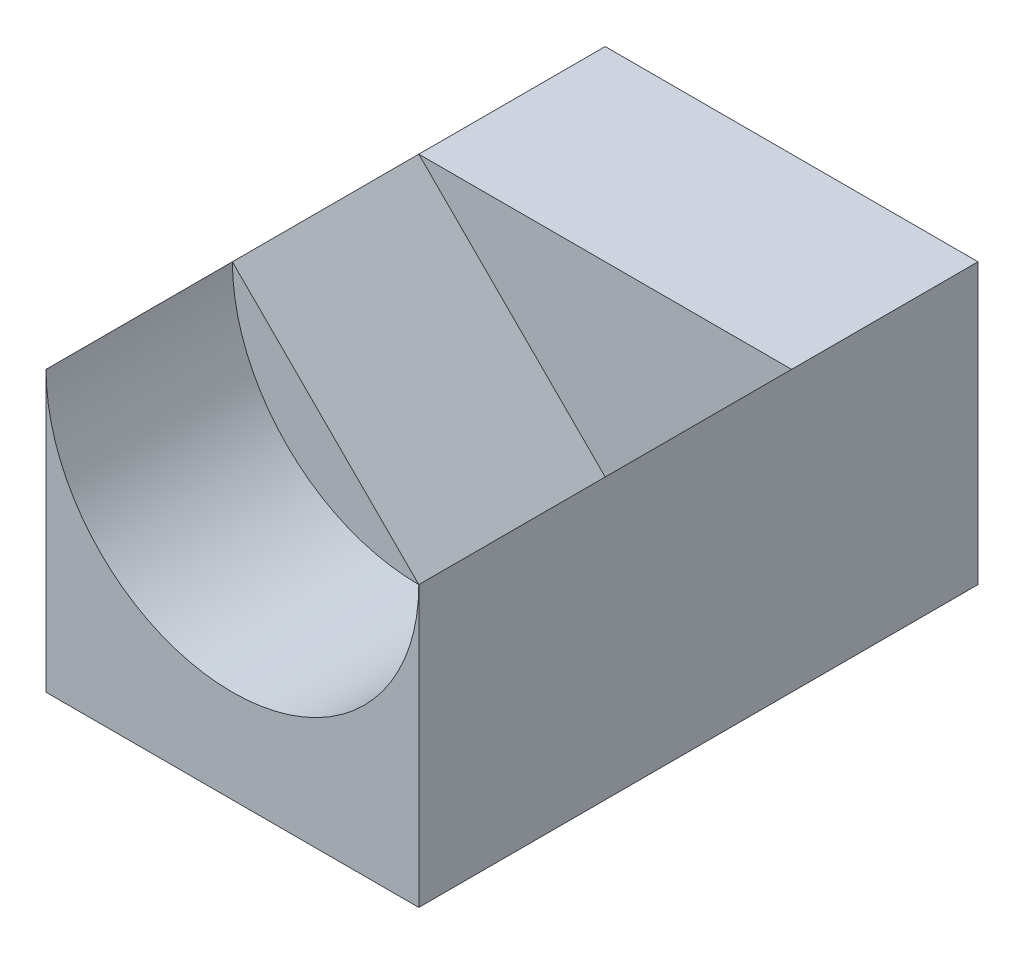
ISO-10303-21;
HEADER;
FILE_DESCRIPTION(('STEP AP214'),'2;1');
FILE_NAME('part.step','',(''),(''),'','','');
FILE_SCHEMA(('AUTOMOTIVE_DESIGN { 1 0 10303 214 1 1 1 1 }'));
ENDSEC;
DATA;
#1=APPLICATION_CONTEXT('core data for automotive mechanical design processes');
#2=APPLICATION_PROTOCOL_DEFINITION('international standard','automotive_design',2000,#1);
#3=PRODUCT_CONTEXT('',#1,'mechanical');
#4=PRODUCT('Part','Part','',(#3));
#5=PRODUCT_RELATED_PRODUCT_CATEGORY('part','',(#4));
#6=PRODUCT_DEFINITION_FORMATION('','',#4);
#7=PRODUCT_DEFINITION_CONTEXT('part definition',#1,'design');
#8=PRODUCT_DEFINITION('design','',#6,#7);
#9=PRODUCT_DEFINITION_SHAPE('','',#8);
#10=(LENGTH_UNIT() NAMED_UNIT(*) SI_UNIT(.MILLI.,.METRE.));
#11=(NAMED_UNIT(*) PLANE_ANGLE_UNIT() SI_UNIT($,.RADIAN.));
#12=(NAMED_UNIT(*) SI_UNIT($,.STERADIAN.) SOLID_ANGLE_UNIT());
#13=UNCERTAINTY_MEASURE_WITH_UNIT(LENGTH_MEASURE(1.E-05),#10,'distance_accuracy_value','');
#14=(GEOMETRIC_REPRESENTATION_CONTEXT(3) GLOBAL_UNCERTAINTY_ASSIGNED_CONTEXT((#13)) GLOBAL_UNIT_ASSIGNED_CONTEXT((#10,
#11,#12)) REPRESENTATION_CONTEXT('',''));
#15=CARTESIAN_POINT('',(0.,0.,0.));
#16=DIRECTION('',(0.,0.,1.));
#17=DIRECTION('',(1.,0.,0.));
#18=AXIS2_PLACEMENT_3D('',#15,#16,#17);
#19=CARTESIAN_POINT('',(0.,0.,0.));
#20=DIRECTION('',(0.,1.,0.));
#21=DIRECTION('',(0.,0.,1.));
#22=AXIS2_PLACEMENT_3D('',#19,#20,#21);
#23=PLANE('',#22);
#24=DIRECTION('',(0.,0.,1.));
#25=VECTOR('',#24,1.);
#26=CARTESIAN_POINT('',(-10.,0.,-15.));
#27=LINE('',#26,#25);
#28=CARTESIAN_POINT('',(-10.,0.,-15.));
#29=VERTEX_POINT('',#28);
#30=CARTESIAN_POINT('',(-9.99999999999999,0.,-5.));
#31=VERTEX_POINT('',#30);
#32=EDGE_CURVE('E93',#29,#31,#27,.T.);
#33=ORIENTED_EDGE('',*,*,#32,.T.);
#34=DIRECTION('',(-1.,0.,0.));
#35=VECTOR('',#34,1.);
#36=CARTESIAN_POINT('',(10.,0.,-5.));
#37=LINE('',#36,#35);
#38=CARTESIAN_POINT('',(10.,0.,-5.));
#39=VERTEX_POINT('',#38);
#40=EDGE_CURVE('E140',#39,#31,#37,.T.);
#41=ORIENTED_EDGE('',*,*,#40,.F.);
#42=DIRECTION('',(0.,0.,-1.));
#43=VECTOR('',#42,1.);
#44=CARTESIAN_POINT('',(10.,0.,-15.));
#45=LINE('',#44,#43);
#46=CARTESIAN_POINT('',(10.,0.,-15.));
#47=VERTEX_POINT('',#46);
#48=EDGE_CURVE('E63',#39,#47,#45,.T.);
#49=ORIENTED_EDGE('',*,*,#48,.T.);
#50=DIRECTION('',(-1.,0.,0.));
#51=VECTOR('',#50,1.);
#52=CARTESIAN_POINT('',(-10.,0.,-15.));
#53=LINE('',#52,#51);
#54=EDGE_CURVE('E114',#47,#29,#53,.T.);
#55=ORIENTED_EDGE('',*,*,#54,.T.);
#56=EDGE_LOOP('',(#33,#41,#49,#55));
#57=FACE_BOUND('',#56,.T.);
#58=ADVANCED_FACE('F33',(#57),#23,.T.);
#59=CARTESIAN_POINT('',(0.,0.,5.));
#60=DIRECTION('',(0.,0.,1.));
#61=DIRECTION('',(1.,0.,0.));
#62=AXIS2_PLACEMENT_3D('',#59,#60,#61);
#63=PLANE('',#62);
#64=DIRECTION('',(0.707106781186548,0.707106781186547,0.));
#65=VECTOR('',#64,1.);
#66=CARTESIAN_POINT('',(0.,-10.,5.));
#67=LINE('',#66,#65);
#68=CARTESIAN_POINT('',(0.,-10.,5.));
#69=VERTEX_POINT('',#68);
#70=CARTESIAN_POINT('',(10.,0.,5.));
#71=VERTEX_POINT('',#70);
#72=EDGE_CURVE('E137',#69,#71,#67,.T.);
#73=ORIENTED_EDGE('',*,*,#72,.F.);
#74=CARTESIAN_POINT('',(0.,0.,5.));
#75=DIRECTION('',(0.,0.,1.));
#76=DIRECTION('',(1.,0.,0.));
#77=AXIS2_PLACEMENT_3D('',#74,#75,#76);
#78=CIRCLE('',#77,10.);
#79=EDGE_CURVE('E126',#69,#71,#78,.T.);
#80=ORIENTED_EDGE('',*,*,#79,.T.);
#81=EDGE_LOOP('',(#73,#80));
#82=FACE_BOUND('',#81,.T.);
#83=ADVANCED_FACE('F158',(#82),#63,.T.);
#84=CARTESIAN_POINT('',(10.,-15.,-15.));
#85=DIRECTION('',(1.,0.,0.));
#86=DIRECTION('',(0.,0.,-1.));
#87=AXIS2_PLACEMENT_3D('',#84,#85,#86);
#88=PLANE('',#87);
#89=CARTESIAN_POINT('',(10.,0.,15.));
#90=VERTEX_POINT('',#89);
#91=EDGE_CURVE('E111',#90,#71,#45,.T.);
#92=ORIENTED_EDGE('',*,*,#91,.F.);
#93=DIRECTION('',(0.,1.,0.));
#94=VECTOR('',#93,1.);
#95=CARTESIAN_POINT('',(10.,-15.,15.));
#96=LINE('',#95,#94);
#97=CARTESIAN_POINT('',(10.,-15.,15.));
#98=VERTEX_POINT('',#97);
#99=EDGE_CURVE('E11',#98,#90,#96,.T.);
#100=ORIENTED_EDGE('',*,*,#99,.F.);
#101=DIRECTION('',(0.,0.,-1.));
#102=VECTOR('',#101,1.);
#103=CARTESIAN_POINT('',(10.,-15.,-15.));
#104=LINE('',#103,#102);
#105=CARTESIAN_POINT('',(10.,-15.,-15.));
#106=VERTEX_POINT('',#105);
#107=EDGE_CURVE('E105',#98,#106,#104,.T.);
#108=ORIENTED_EDGE('',*,*,#107,.T.);
#109=DIRECTION('',(0.,1.,0.));
#110=VECTOR('',#109,1.);
#111=CARTESIAN_POINT('',(10.,-15.,-15.));
#112=LINE('',#111,#110);
#113=EDGE_CURVE('E37',#106,#47,#112,.T.);
#114=ORIENTED_EDGE('',*,*,#113,.T.);
#115=ORIENTED_EDGE('',*,*,#48,.F.);
#116=EDGE_CURVE('E115',#71,#39,#45,.T.);
#117=ORIENTED_EDGE('',*,*,#116,.F.);
#118=EDGE_LOOP('',(#92,#100,#108,#114,#115,#117));
#119=FACE_BOUND('',#118,.T.);
#120=ADVANCED_FACE('F35',(#119),#88,.T.);
#121=CARTESIAN_POINT('',(-10.,-15.,15.));
#122=DIRECTION('',(0.,0.,1.));
#123=DIRECTION('',(1.,0.,0.));
#124=AXIS2_PLACEMENT_3D('',#121,#122,#123);
#125=PLANE('',#124);
#126=CARTESIAN_POINT('',(0.,0.,15.));
#127=DIRECTION('',(0.,0.,1.));
#128=DIRECTION('',(1.,0.,0.));
#129=AXIS2_PLACEMENT_3D('',#126,#127,#128);
#130=CIRCLE('',#129,10.);
#131=CARTESIAN_POINT('',(-10.,0.,15.));
#132=VERTEX_POINT('',#131);
#133=EDGE_CURVE('E124',#132,#90,#130,.T.);
#134=ORIENTED_EDGE('',*,*,#133,.F.);
#135=DIRECTION('',(0.,1.,0.));
#136=VECTOR('',#135,1.);
#137=CARTESIAN_POINT('',(-10.,-15.,15.));
#138=LINE('',#137,#136);
#139=CARTESIAN_POINT('',(-10.,-15.,15.));
#140=VERTEX_POINT('',#139);
#141=EDGE_CURVE('E43',#140,#132,#138,.T.);
#142=ORIENTED_EDGE('',*,*,#141,.F.);
#143=DIRECTION('',(1.,0.,0.));
#144=VECTOR('',#143,1.);
#145=CARTESIAN_POINT('',(-10.,-15.,15.));
#146=LINE('',#145,#144);
#147=EDGE_CURVE('E102',#140,#98,#146,.T.);
#148=ORIENTED_EDGE('',*,*,#147,.T.);
#149=ORIENTED_EDGE('',*,*,#99,.T.);
#150=EDGE_LOOP('',(#134,#142,#148,#149));
#151=FACE_BOUND('',#150,.T.);
#152=ADVANCED_FACE('F122',(#151),#125,.T.);
#153=CARTESIAN_POINT('',(-10.,-15.,-15.));
#154=DIRECTION('',(-1.,0.,0.));
#155=DIRECTION('',(0.,0.,1.));
#156=AXIS2_PLACEMENT_3D('',#153,#154,#155);
#157=PLANE('',#156);
#158=ORIENTED_EDGE('',*,*,#32,.F.);
#159=DIRECTION('',(0.,1.,0.));
#160=VECTOR('',#159,1.);
#161=CARTESIAN_POINT('',(-10.,-15.,-15.));
#162=LINE('',#161,#160);
#163=CARTESIAN_POINT('',(-10.,-15.,-15.));
#164=VERTEX_POINT('',#163);
#165=EDGE_CURVE('E86',#164,#29,#162,.T.);
#166=ORIENTED_EDGE('',*,*,#165,.F.);
#167=DIRECTION('',(0.,0.,1.));
#168=VECTOR('',#167,1.);
#169=CARTESIAN_POINT('',(-10.,-15.,-15.));
#170=LINE('',#169,#168);
#171=EDGE_CURVE('E90',#164,#140,#170,.T.);
#172=ORIENTED_EDGE('',*,*,#171,.T.);
#173=ORIENTED_EDGE('',*,*,#141,.T.);
#174=CARTESIAN_POINT('',(-10.,0.,5.));
#175=VERTEX_POINT('',#174);
#176=EDGE_CURVE('E117',#175,#132,#27,.T.);
#177=ORIENTED_EDGE('',*,*,#176,.F.);
#178=DIRECTION('',(0.,0.,1.));
#179=VECTOR('',#178,1.);
#180=CARTESIAN_POINT('',(-9.99999999999999,0.,-5.));
#181=LINE('',#180,#179);
#182=EDGE_CURVE('E74',#31,#175,#181,.T.);
#183=ORIENTED_EDGE('',*,*,#182,.F.);
#184=EDGE_LOOP('',(#158,#166,#172,#173,#177,#183));
#185=FACE_BOUND('',#184,.T.);
#186=ADVANCED_FACE('F88',(#185),#157,.T.);
#187=CARTESIAN_POINT('',(-10.,-15.,-15.));
#188=DIRECTION('',(0.,0.,-1.));
#189=DIRECTION('',(-1.,0.,0.));
#190=AXIS2_PLACEMENT_3D('',#187,#188,#189);
#191=PLANE('',#190);
#192=ORIENTED_EDGE('',*,*,#54,.F.);
#193=ORIENTED_EDGE('',*,*,#113,.F.);
#194=DIRECTION('',(-1.,0.,0.));
#195=VECTOR('',#194,1.);
#196=CARTESIAN_POINT('',(-10.,-15.,-15.));
#197=LINE('',#196,#195);
#198=EDGE_CURVE('E100',#106,#164,#197,.T.);
#199=ORIENTED_EDGE('',*,*,#198,.T.);
#200=ORIENTED_EDGE('',*,*,#165,.T.);
#201=EDGE_LOOP('',(#192,#193,#199,#200));
#202=FACE_BOUND('',#201,.T.);
#203=ADVANCED_FACE('F104',(#202),#191,.T.);
#204=CARTESIAN_POINT('',(0.,-15.,0.));
#205=DIRECTION('',(0.,1.,0.));
#206=DIRECTION('',(0.,0.,1.));
#207=AXIS2_PLACEMENT_3D('',#204,#205,#206);
#208=PLANE('',#207);
#209=ORIENTED_EDGE('',*,*,#107,.F.);
#210=ORIENTED_EDGE('',*,*,#147,.F.);
#211=ORIENTED_EDGE('',*,*,#171,.F.);
#212=ORIENTED_EDGE('',*,*,#198,.F.);
#213=EDGE_LOOP('',(#209,#210,#211,#212));
#214=FACE_BOUND('',#213,.T.);
#215=ADVANCED_FACE('F99',(#214),#208,.F.);
#216=CARTESIAN_POINT('',(0.,0.,5.));
#217=DIRECTION('',(0.,0.,1.));
#218=DIRECTION('',(1.,0.,0.));
#219=AXIS2_PLACEMENT_3D('',#216,#217,#218);
#220=CYLINDRICAL_SURFACE('',#219,10.);
#221=ORIENTED_EDGE('',*,*,#176,.T.);
#222=ORIENTED_EDGE('',*,*,#133,.T.);
#223=ORIENTED_EDGE('',*,*,#91,.T.);
#224=ORIENTED_EDGE('',*,*,#79,.F.);
#225=EDGE_CURVE('E129',#175,#69,#78,.T.);
#226=ORIENTED_EDGE('',*,*,#225,.F.);
#227=EDGE_LOOP('',(#221,#222,#223,#224,#226));
#228=FACE_BOUND('',#227,.T.);
#229=ADVANCED_FACE('F176',(#228),#220,.F.);
#230=DIRECTION('',(0.70710678118655,-0.707106781186545,0.));
#231=VECTOR('',#230,1.);
#232=CARTESIAN_POINT('',(-9.99999999999999,0.,5.));
#233=LINE('',#232,#231);
#234=EDGE_CURVE('E141',#175,#69,#233,.T.);
#235=ORIENTED_EDGE('',*,*,#234,.F.);
#236=ORIENTED_EDGE('',*,*,#225,.T.);
#237=EDGE_LOOP('',(#235,#236));
#238=FACE_BOUND('',#237,.T.);
#239=ADVANCED_FACE('F165',(#238),#63,.T.);
#240=CARTESIAN_POINT('',(0.,-10.,-5.));
#241=DIRECTION('',(0.707106781186547,-0.707106781186548,0.));
#242=DIRECTION('',(0.707106781186548,0.707106781186547,0.));
#243=AXIS2_PLACEMENT_3D('',#240,#241,#242);
#244=PLANE('',#243);
#245=ORIENTED_EDGE('',*,*,#72,.T.);
#246=ORIENTED_EDGE('',*,*,#116,.T.);
#247=DIRECTION('',(0.707106781186548,0.707106781186547,0.));
#248=VECTOR('',#247,1.);
#249=CARTESIAN_POINT('',(0.,-10.,-5.));
#250=LINE('',#249,#248);
#251=CARTESIAN_POINT('',(0.,-10.,-5.));
#252=VERTEX_POINT('',#251);
#253=EDGE_CURVE('E135',#252,#39,#250,.T.);
#254=ORIENTED_EDGE('',*,*,#253,.F.);
#255=DIRECTION('',(0.,0.,1.));
#256=VECTOR('',#255,1.);
#257=CARTESIAN_POINT('',(0.,-10.,-5.));
#258=LINE('',#257,#256);
#259=EDGE_CURVE('E127',#252,#69,#258,.T.);
#260=ORIENTED_EDGE('',*,*,#259,.T.);
#261=EDGE_LOOP('',(#245,#246,#254,#260));
#262=FACE_BOUND('',#261,.T.);
#263=ADVANCED_FACE('F183',(#262),#244,.F.);
#264=CARTESIAN_POINT('',(-9.99999999999999,0.,-5.));
#265=DIRECTION('',(-0.707106781186545,-0.70710678118655,0.));
#266=DIRECTION('',(0.70710678118655,-0.707106781186545,0.));
#267=AXIS2_PLACEMENT_3D('',#264,#265,#266);
#268=PLANE('',#267);
#269=ORIENTED_EDGE('',*,*,#234,.T.);
#270=ORIENTED_EDGE('',*,*,#259,.F.);
#271=DIRECTION('',(0.70710678118655,-0.707106781186545,0.));
#272=VECTOR('',#271,1.);
#273=CARTESIAN_POINT('',(-9.99999999999999,0.,-5.));
#274=LINE('',#273,#272);
#275=EDGE_CURVE('E145',#31,#252,#274,.T.);
#276=ORIENTED_EDGE('',*,*,#275,.F.);
#277=ORIENTED_EDGE('',*,*,#182,.T.);
#278=EDGE_LOOP('',(#269,#270,#276,#277));
#279=FACE_BOUND('',#278,.T.);
#280=ADVANCED_FACE('F186',(#279),#268,.F.);
#281=CARTESIAN_POINT('',(0.,0.,-5.));
#282=DIRECTION('',(0.,0.,1.));
#283=DIRECTION('',(1.,0.,0.));
#284=AXIS2_PLACEMENT_3D('',#281,#282,#283);
#285=PLANE('',#284);
#286=ORIENTED_EDGE('',*,*,#40,.T.);
#287=ORIENTED_EDGE('',*,*,#275,.T.);
#288=ORIENTED_EDGE('',*,*,#253,.T.);
#289=EDGE_LOOP('',(#286,#287,#288));
#290=FACE_BOUND('',#289,.T.);
#291=ADVANCED_FACE('F151',(#290),#285,.T.);
#292=CLOSED_SHELL('',(#58,#83,#120,#152,#186,#203,#215,#229,#239,#263,#280,#291));
#293=MANIFOLD_SOLID_BREP('B2',#292);
#294=ADVANCED_BREP_SHAPE_REPRESENTATION('',(#18,#293),#14);
#295=SHAPE_DEFINITION_REPRESENTATION(#9,#294);
ENDSEC;
END-ISO-10303-21;
